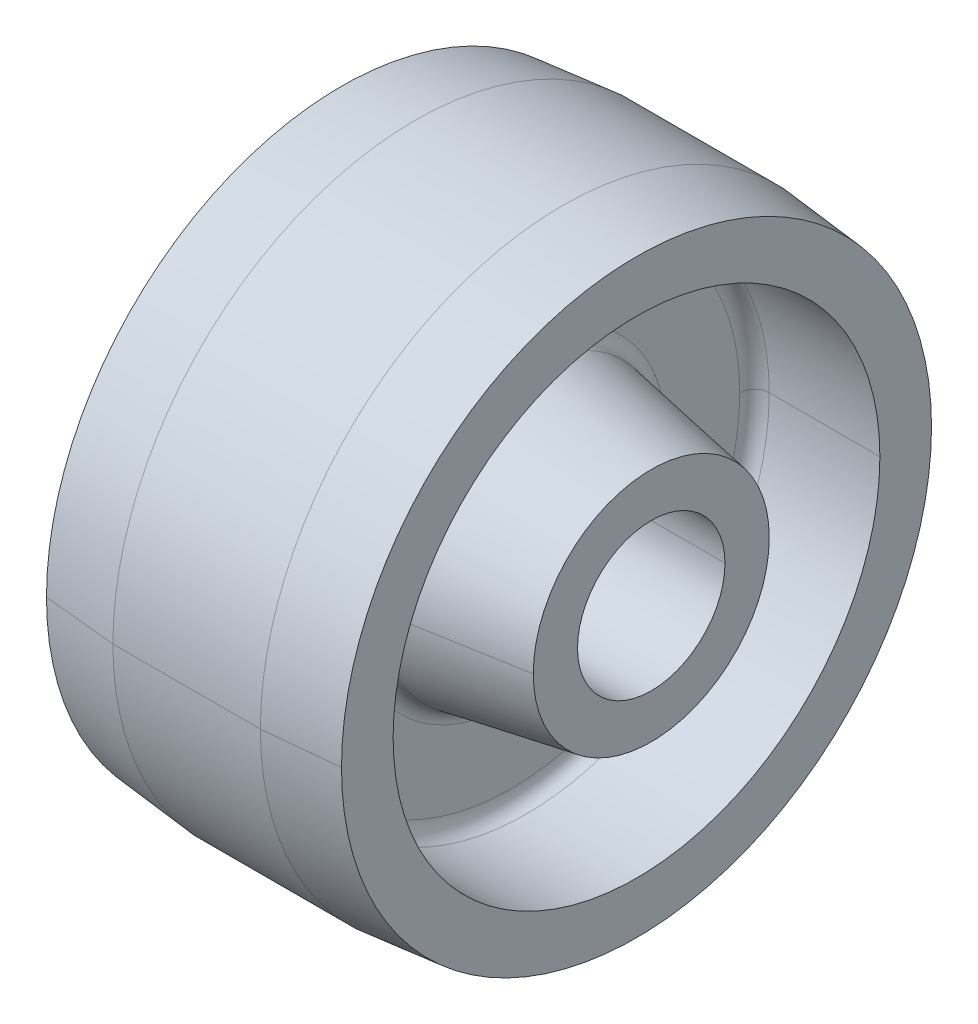
ISO-10303-21;
HEADER;
FILE_DESCRIPTION(('STEP AP214'),'2;1');
FILE_NAME('part.step','',(''),(''),'','','');
FILE_SCHEMA(('AUTOMOTIVE_DESIGN { 1 0 10303 214 1 1 1 1 }'));
ENDSEC;
DATA;
#1=APPLICATION_CONTEXT('core data for automotive mechanical design processes');
#2=APPLICATION_PROTOCOL_DEFINITION('international standard','automotive_design',2000,#1);
#3=PRODUCT_CONTEXT('',#1,'mechanical');
#4=PRODUCT('Part','Part','',(#3));
#5=PRODUCT_RELATED_PRODUCT_CATEGORY('part','',(#4));
#6=PRODUCT_DEFINITION_FORMATION('','',#4);
#7=PRODUCT_DEFINITION_CONTEXT('part definition',#1,'design');
#8=PRODUCT_DEFINITION('design','',#6,#7);
#9=PRODUCT_DEFINITION_SHAPE('','',#8);
#10=(LENGTH_UNIT() NAMED_UNIT(*) SI_UNIT(.MILLI.,.METRE.));
#11=(NAMED_UNIT(*) PLANE_ANGLE_UNIT() SI_UNIT($,.RADIAN.));
#12=(NAMED_UNIT(*) SI_UNIT($,.STERADIAN.) SOLID_ANGLE_UNIT());
#13=UNCERTAINTY_MEASURE_WITH_UNIT(LENGTH_MEASURE(1.E-05),#10,'distance_accuracy_value','');
#14=(GEOMETRIC_REPRESENTATION_CONTEXT(3) GLOBAL_UNCERTAINTY_ASSIGNED_CONTEXT((#13)) GLOBAL_UNIT_ASSIGNED_CONTEXT((#10,
#11,#12)) REPRESENTATION_CONTEXT('',''));
#15=CARTESIAN_POINT('',(0.,0.,0.));
#16=DIRECTION('',(0.,0.,1.));
#17=DIRECTION('',(1.,0.,0.));
#18=AXIS2_PLACEMENT_3D('',#15,#16,#17);
#19=CARTESIAN_POINT('',(-2.5,0.,0.));
#20=DIRECTION('',(-1.,0.,0.));
#21=DIRECTION('',(0.,0.,1.));
#22=AXIS2_PLACEMENT_3D('',#19,#20,#21);
#23=TOROIDAL_SURFACE('',#22,10.5142059479076,1.);
#24=CARTESIAN_POINT('',(-2.5,0.,-10.5142059479076));
#25=DIRECTION('',(0.,1.,0.));
#26=DIRECTION('',(0.,0.,1.));
#27=AXIS2_PLACEMENT_3D('',#24,#25,#26);
#28=CIRCLE('',#27,1.);
#29=CARTESIAN_POINT('',(-2.32635182233308,0.,-9.52939819489542));
#30=VERTEX_POINT('',#29);
#31=CARTESIAN_POINT('',(-1.5,0.,-10.5142059479076));
#32=VERTEX_POINT('',#31);
#33=EDGE_CURVE('E1033',#30,#32,#28,.T.);
#34=ORIENTED_EDGE('',*,*,#33,.F.);
#35=CARTESIAN_POINT('',(-2.32635182233308,0.,0.));
#36=DIRECTION('',(-1.,0.,0.));
#37=DIRECTION('',(0.,0.,1.));
#38=AXIS2_PLACEMENT_3D('',#35,#36,#37);
#39=CIRCLE('',#38,9.52939819489542);
#40=CARTESIAN_POINT('',(-2.32635182233308,0.,9.52939819489542));
#41=VERTEX_POINT('',#40);
#42=EDGE_CURVE('E326',#41,#30,#39,.T.);
#43=ORIENTED_EDGE('',*,*,#42,.F.);
#44=CARTESIAN_POINT('',(-2.5,0.,10.5142059479076));
#45=DIRECTION('',(0.,-1.,0.));
#46=DIRECTION('',(0.,0.,-1.));
#47=AXIS2_PLACEMENT_3D('',#44,#45,#46);
#48=CIRCLE('',#47,1.);
#49=CARTESIAN_POINT('',(-1.5,0.,10.5142059479076));
#50=VERTEX_POINT('',#49);
#51=EDGE_CURVE('E212',#41,#50,#48,.T.);
#52=ORIENTED_EDGE('',*,*,#51,.T.);
#53=CARTESIAN_POINT('',(-1.5,0.,0.));
#54=DIRECTION('',(-1.,0.,0.));
#55=DIRECTION('',(0.,0.,1.));
#56=AXIS2_PLACEMENT_3D('',#53,#54,#55);
#57=CIRCLE('',#56,10.5142059479076);
#58=EDGE_CURVE('E11',#50,#32,#57,.T.);
#59=ORIENTED_EDGE('',*,*,#58,.T.);
#60=EDGE_LOOP('',(#34,#43,#52,#59));
#61=FACE_BOUND('',#60,.T.);
#62=ADVANCED_FACE('F16',(#61),#23,.F.);
#63=CARTESIAN_POINT('',(-1.5,15.5,0.));
#64=DIRECTION('',(-1.,0.,0.));
#65=DIRECTION('',(0.,0.,1.));
#66=AXIS2_PLACEMENT_3D('',#63,#64,#65);
#67=PLANE('',#66);
#68=ORIENTED_EDGE('',*,*,#58,.F.);
#69=CARTESIAN_POINT('',(-1.5,0.,0.));
#70=DIRECTION('',(-1.,0.,0.));
#71=DIRECTION('',(0.,0.,1.));
#72=AXIS2_PLACEMENT_3D('',#69,#70,#71);
#73=CIRCLE('',#72,10.5142059479076);
#74=EDGE_CURVE('E219',#32,#50,#73,.T.);
#75=ORIENTED_EDGE('',*,*,#74,.F.);
#76=EDGE_LOOP('',(#68,#75));
#77=FACE_BOUND('',#76,.T.);
#78=CARTESIAN_POINT('',(-1.5,0.,0.));
#79=DIRECTION('',(-1.,0.,0.));
#80=DIRECTION('',(0.,0.,1.));
#81=AXIS2_PLACEMENT_3D('',#78,#79,#80);
#82=CIRCLE('',#81,15.5);
#83=CARTESIAN_POINT('',(-1.5,0.,15.5));
#84=VERTEX_POINT('',#83);
#85=CARTESIAN_POINT('',(-1.5,0.,-15.5));
#86=VERTEX_POINT('',#85);
#87=EDGE_CURVE('E24',#84,#86,#82,.T.);
#88=ORIENTED_EDGE('',*,*,#87,.T.);
#89=CARTESIAN_POINT('',(-1.5,0.,0.));
#90=DIRECTION('',(-1.,0.,0.));
#91=DIRECTION('',(0.,0.,1.));
#92=AXIS2_PLACEMENT_3D('',#89,#90,#91);
#93=CIRCLE('',#92,15.5);
#94=EDGE_CURVE('E191',#86,#84,#93,.T.);
#95=ORIENTED_EDGE('',*,*,#94,.T.);
#96=EDGE_LOOP('',(#88,#95));
#97=FACE_BOUND('',#96,.T.);
#98=ADVANCED_FACE('F188',(#77,#97),#67,.T.);
#99=CARTESIAN_POINT('',(-2.5,0.,0.));
#100=DIRECTION('',(-1.,0.,0.));
#101=DIRECTION('',(0.,0.,1.));
#102=AXIS2_PLACEMENT_3D('',#99,#100,#101);
#103=TOROIDAL_SURFACE('',#102,15.5,1.);
#104=CARTESIAN_POINT('',(-2.5,0.,-15.5));
#105=DIRECTION('',(0.,1.,0.));
#106=DIRECTION('',(0.,0.,1.));
#107=AXIS2_PLACEMENT_3D('',#104,#105,#106);
#108=CIRCLE('',#107,1.);
#109=CARTESIAN_POINT('',(-2.5,0.,-16.5));
#110=VERTEX_POINT('',#109);
#111=EDGE_CURVE('E199',#86,#110,#108,.T.);
#112=ORIENTED_EDGE('',*,*,#111,.F.);
#113=ORIENTED_EDGE('',*,*,#87,.F.);
#114=CARTESIAN_POINT('',(-2.5,0.,15.5));
#115=DIRECTION('',(0.,-1.,0.));
#116=DIRECTION('',(0.,0.,-1.));
#117=AXIS2_PLACEMENT_3D('',#114,#115,#116);
#118=CIRCLE('',#117,1.);
#119=CARTESIAN_POINT('',(-2.5,0.,16.5));
#120=VERTEX_POINT('',#119);
#121=EDGE_CURVE('E210',#84,#120,#118,.T.);
#122=ORIENTED_EDGE('',*,*,#121,.T.);
#123=CARTESIAN_POINT('',(-2.5,0.,0.));
#124=DIRECTION('',(-1.,0.,0.));
#125=DIRECTION('',(0.,0.,1.));
#126=AXIS2_PLACEMENT_3D('',#123,#124,#125);
#127=CIRCLE('',#126,16.5);
#128=EDGE_CURVE('E175',#120,#110,#127,.T.);
#129=ORIENTED_EDGE('',*,*,#128,.T.);
#130=EDGE_LOOP('',(#112,#113,#122,#129));
#131=FACE_BOUND('',#130,.T.);
#132=ADVANCED_FACE('F200',(#131),#103,.F.);
#133=CARTESIAN_POINT('',(-9.17002422126663,0.,0.));
#134=DIRECTION('',(-1.,0.,0.));
#135=DIRECTION('',(0.,0.,1.));
#136=AXIS2_PLACEMENT_3D('',#133,#134,#135);
#137=CYLINDRICAL_SURFACE('',#136,16.5);
#138=DIRECTION('',(-1.,0.,0.));
#139=VECTOR('',#138,1.);
#140=CARTESIAN_POINT('',(-9.17002422126663,0.,-16.5));
#141=LINE('',#140,#139);
#142=CARTESIAN_POINT('',(-10.,0.,-16.5));
#143=VERTEX_POINT('',#142);
#144=EDGE_CURVE('E247',#110,#143,#141,.T.);
#145=ORIENTED_EDGE('',*,*,#144,.F.);
#146=ORIENTED_EDGE('',*,*,#128,.F.);
#147=DIRECTION('',(-1.,0.,0.));
#148=VECTOR('',#147,1.);
#149=CARTESIAN_POINT('',(-9.17002422126663,0.,16.5));
#150=LINE('',#149,#148);
#151=CARTESIAN_POINT('',(-10.,0.,16.5));
#152=VERTEX_POINT('',#151);
#153=EDGE_CURVE('E236',#120,#152,#150,.T.);
#154=ORIENTED_EDGE('',*,*,#153,.T.);
#155=CARTESIAN_POINT('',(-10.,0.,0.));
#156=DIRECTION('',(-1.,0.,0.));
#157=DIRECTION('',(0.,0.,1.));
#158=AXIS2_PLACEMENT_3D('',#155,#156,#157);
#159=CIRCLE('',#158,16.5);
#160=EDGE_CURVE('E128',#152,#143,#159,.T.);
#161=ORIENTED_EDGE('',*,*,#160,.T.);
#162=EDGE_LOOP('',(#145,#146,#154,#161));
#163=FACE_BOUND('',#162,.T.);
#164=ADVANCED_FACE('F716',(#163),#137,.F.);
#165=CARTESIAN_POINT('',(2.5,0.,0.));
#166=DIRECTION('',(-1.,0.,0.));
#167=DIRECTION('',(0.,0.,1.));
#168=AXIS2_PLACEMENT_3D('',#165,#166,#167);
#169=TOROIDAL_SURFACE('',#168,15.5,1.);
#170=CARTESIAN_POINT('',(2.5,0.,-15.5));
#171=DIRECTION('',(0.,1.,0.));
#172=DIRECTION('',(0.,0.,1.));
#173=AXIS2_PLACEMENT_3D('',#170,#171,#172);
#174=CIRCLE('',#173,1.);
#175=CARTESIAN_POINT('',(2.5,0.,-16.5));
#176=VERTEX_POINT('',#175);
#177=CARTESIAN_POINT('',(1.5,0.,-15.5));
#178=VERTEX_POINT('',#177);
#179=EDGE_CURVE('E235',#176,#178,#174,.T.);
#180=ORIENTED_EDGE('',*,*,#179,.F.);
#181=CARTESIAN_POINT('',(2.5,0.,0.));
#182=DIRECTION('',(-1.,0.,0.));
#183=DIRECTION('',(0.,0.,1.));
#184=AXIS2_PLACEMENT_3D('',#181,#182,#183);
#185=CIRCLE('',#184,16.5);
#186=CARTESIAN_POINT('',(2.5,0.,16.5));
#187=VERTEX_POINT('',#186);
#188=EDGE_CURVE('E240',#187,#176,#185,.T.);
#189=ORIENTED_EDGE('',*,*,#188,.F.);
#190=CARTESIAN_POINT('',(2.5,0.,15.5));
#191=DIRECTION('',(0.,-1.,0.));
#192=DIRECTION('',(0.,0.,-1.));
#193=AXIS2_PLACEMENT_3D('',#190,#191,#192);
#194=CIRCLE('',#193,1.);
#195=CARTESIAN_POINT('',(1.5,0.,15.5));
#196=VERTEX_POINT('',#195);
#197=EDGE_CURVE('E223',#187,#196,#194,.T.);
#198=ORIENTED_EDGE('',*,*,#197,.T.);
#199=CARTESIAN_POINT('',(1.5,0.,0.));
#200=DIRECTION('',(-1.,0.,0.));
#201=DIRECTION('',(0.,0.,1.));
#202=AXIS2_PLACEMENT_3D('',#199,#200,#201);
#203=CIRCLE('',#202,15.5);
#204=EDGE_CURVE('E171',#196,#178,#203,.T.);
#205=ORIENTED_EDGE('',*,*,#204,.T.);
#206=EDGE_LOOP('',(#180,#189,#198,#205));
#207=FACE_BOUND('',#206,.T.);
#208=ADVANCED_FACE('F705',(#207),#169,.F.);
#209=CARTESIAN_POINT('',(1.5,10.5142059479076,0.));
#210=DIRECTION('',(1.,0.,0.));
#211=DIRECTION('',(0.,1.,0.));
#212=AXIS2_PLACEMENT_3D('',#209,#210,#211);
#213=PLANE('',#212);
#214=CARTESIAN_POINT('',(1.5,0.,0.));
#215=DIRECTION('',(-1.,0.,0.));
#216=DIRECTION('',(0.,0.,1.));
#217=AXIS2_PLACEMENT_3D('',#214,#215,#216);
#218=CIRCLE('',#217,10.5142059479076);
#219=CARTESIAN_POINT('',(1.5,0.,10.5142059479076));
#220=VERTEX_POINT('',#219);
#221=CARTESIAN_POINT('',(1.5,0.,-10.5142059479076));
#222=VERTEX_POINT('',#221);
#223=EDGE_CURVE('E176',#220,#222,#218,.T.);
#224=ORIENTED_EDGE('',*,*,#223,.T.);
#225=CARTESIAN_POINT('',(1.5,0.,0.));
#226=DIRECTION('',(-1.,0.,0.));
#227=DIRECTION('',(0.,0.,1.));
#228=AXIS2_PLACEMENT_3D('',#225,#226,#227);
#229=CIRCLE('',#228,10.5142059479076);
#230=EDGE_CURVE('E264',#222,#220,#229,.T.);
#231=ORIENTED_EDGE('',*,*,#230,.T.);
#232=EDGE_LOOP('',(#224,#231));
#233=FACE_BOUND('',#232,.T.);
#234=ORIENTED_EDGE('',*,*,#204,.F.);
#235=CARTESIAN_POINT('',(1.5,0.,0.));
#236=DIRECTION('',(-1.,0.,0.));
#237=DIRECTION('',(0.,0.,1.));
#238=AXIS2_PLACEMENT_3D('',#235,#236,#237);
#239=CIRCLE('',#238,15.5);
#240=EDGE_CURVE('E269',#178,#196,#239,.T.);
#241=ORIENTED_EDGE('',*,*,#240,.F.);
#242=EDGE_LOOP('',(#234,#241));
#243=FACE_BOUND('',#242,.T.);
#244=ADVANCED_FACE('F694',(#233,#243),#213,.T.);
#245=CARTESIAN_POINT('',(2.5,0.,0.));
#246=DIRECTION('',(-1.,0.,0.));
#247=DIRECTION('',(0.,0.,1.));
#248=AXIS2_PLACEMENT_3D('',#245,#246,#247);
#249=TOROIDAL_SURFACE('',#248,10.5142059479076,1.);
#250=CARTESIAN_POINT('',(2.5,0.,-10.5142059479076));
#251=DIRECTION('',(0.,1.,0.));
#252=DIRECTION('',(0.,0.,1.));
#253=AXIS2_PLACEMENT_3D('',#250,#251,#252);
#254=CIRCLE('',#253,1.);
#255=CARTESIAN_POINT('',(2.32635182233308,0.,-9.52939819489541));
#256=VERTEX_POINT('',#255);
#257=EDGE_CURVE('E268',#222,#256,#254,.T.);
#258=ORIENTED_EDGE('',*,*,#257,.F.);
#259=ORIENTED_EDGE('',*,*,#223,.F.);
#260=CARTESIAN_POINT('',(2.5,0.,10.5142059479076));
#261=DIRECTION('',(0.,-1.,0.));
#262=DIRECTION('',(0.,0.,-1.));
#263=AXIS2_PLACEMENT_3D('',#260,#261,#262);
#264=CIRCLE('',#263,1.);
#265=CARTESIAN_POINT('',(2.32635182233308,0.,9.52939819489541));
#266=VERTEX_POINT('',#265);
#267=EDGE_CURVE('E280',#220,#266,#264,.T.);
#268=ORIENTED_EDGE('',*,*,#267,.T.);
#269=CARTESIAN_POINT('',(2.32635182233308,0.,0.));
#270=DIRECTION('',(-1.,0.,0.));
#271=DIRECTION('',(0.,0.,1.));
#272=AXIS2_PLACEMENT_3D('',#269,#270,#271);
#273=CIRCLE('',#272,9.52939819489542);
#274=EDGE_CURVE('E161',#266,#256,#273,.T.);
#275=ORIENTED_EDGE('',*,*,#274,.T.);
#276=EDGE_LOOP('',(#258,#259,#268,#275));
#277=FACE_BOUND('',#276,.T.);
#278=ADVANCED_FACE('F685',(#277),#249,.F.);
#279=CARTESIAN_POINT('',(-9.17002422126663,0.,0.));
#280=DIRECTION('',(-1.,0.,0.));
#281=DIRECTION('',(0.,0.,1.));
#282=AXIS2_PLACEMENT_3D('',#279,#280,#281);
#283=CYLINDRICAL_SURFACE('',#282,16.5);
#284=DIRECTION('',(-1.,0.,0.));
#285=VECTOR('',#284,1.);
#286=CARTESIAN_POINT('',(-9.17002422126663,0.,-16.5));
#287=LINE('',#286,#285);
#288=CARTESIAN_POINT('',(10.,0.,-16.5));
#289=VERTEX_POINT('',#288);
#290=EDGE_CURVE('E291',#289,#176,#287,.T.);
#291=ORIENTED_EDGE('',*,*,#290,.F.);
#292=CARTESIAN_POINT('',(10.,0.,0.));
#293=DIRECTION('',(-1.,0.,0.));
#294=DIRECTION('',(0.,0.,1.));
#295=AXIS2_PLACEMENT_3D('',#292,#293,#294);
#296=CIRCLE('',#295,16.5);
#297=CARTESIAN_POINT('',(10.,0.,16.5));
#298=VERTEX_POINT('',#297);
#299=EDGE_CURVE('E127',#298,#289,#296,.T.);
#300=ORIENTED_EDGE('',*,*,#299,.F.);
#301=DIRECTION('',(-1.,0.,0.));
#302=VECTOR('',#301,1.);
#303=CARTESIAN_POINT('',(-9.17002422126663,0.,16.5));
#304=LINE('',#303,#302);
#305=EDGE_CURVE('E295',#298,#187,#304,.T.);
#306=ORIENTED_EDGE('',*,*,#305,.T.);
#307=ORIENTED_EDGE('',*,*,#188,.T.);
#308=EDGE_LOOP('',(#291,#300,#306,#307));
#309=FACE_BOUND('',#308,.T.);
#310=ADVANCED_FACE('F352',(#309),#283,.F.);
#311=CARTESIAN_POINT('',(-21.4247117377399,0.,0.));
#312=DIRECTION('',(-1.,0.,0.));
#313=DIRECTION('',(0.,0.,1.));
#314=AXIS2_PLACEMENT_3D('',#311,#312,#313);
#315=CYLINDRICAL_SURFACE('',#314,5.);
#316=DIRECTION('',(-1.,0.,0.));
#317=VECTOR('',#316,1.);
#318=CARTESIAN_POINT('',(-21.4247117377399,0.,-5.));
#319=LINE('',#318,#317);
#320=CARTESIAN_POINT('',(11.,0.,-5.));
#321=VERTEX_POINT('',#320);
#322=CARTESIAN_POINT('',(-11.,0.,-5.));
#323=VERTEX_POINT('',#322);
#324=EDGE_CURVE('E302',#321,#323,#319,.T.);
#325=ORIENTED_EDGE('',*,*,#324,.F.);
#326=CARTESIAN_POINT('',(11.,0.,0.));
#327=DIRECTION('',(-1.,0.,0.));
#328=DIRECTION('',(0.,0.,1.));
#329=AXIS2_PLACEMENT_3D('',#326,#327,#328);
#330=CIRCLE('',#329,5.);
#331=CARTESIAN_POINT('',(11.,0.,5.));
#332=VERTEX_POINT('',#331);
#333=EDGE_CURVE('E227',#332,#321,#330,.T.);
#334=ORIENTED_EDGE('',*,*,#333,.F.);
#335=DIRECTION('',(-1.,0.,0.));
#336=VECTOR('',#335,1.);
#337=CARTESIAN_POINT('',(-21.4247117377399,0.,5.));
#338=LINE('',#337,#336);
#339=CARTESIAN_POINT('',(-11.,0.,5.));
#340=VERTEX_POINT('',#339);
#341=EDGE_CURVE('E311',#332,#340,#338,.T.);
#342=ORIENTED_EDGE('',*,*,#341,.T.);
#343=CARTESIAN_POINT('',(-11.,0.,0.));
#344=DIRECTION('',(-1.,0.,0.));
#345=DIRECTION('',(0.,0.,1.));
#346=AXIS2_PLACEMENT_3D('',#343,#344,#345);
#347=CIRCLE('',#346,5.);
#348=EDGE_CURVE('E169',#340,#323,#347,.T.);
#349=ORIENTED_EDGE('',*,*,#348,.T.);
#350=EDGE_LOOP('',(#325,#334,#342,#349));
#351=FACE_BOUND('',#350,.T.);
#352=ADVANCED_FACE('F581',(#351),#315,.F.);
#353=CARTESIAN_POINT('',(-11.,5.,0.));
#354=DIRECTION('',(1.,0.,0.));
#355=DIRECTION('',(0.,1.,0.));
#356=AXIS2_PLACEMENT_3D('',#353,#354,#355);
#357=PLANE('',#356);
#358=ORIENTED_EDGE('',*,*,#348,.F.);
#359=CARTESIAN_POINT('',(-11.,0.,0.));
#360=DIRECTION('',(-1.,0.,0.));
#361=DIRECTION('',(0.,0.,1.));
#362=AXIS2_PLACEMENT_3D('',#359,#360,#361);
#363=CIRCLE('',#362,5.);
#364=EDGE_CURVE('E307',#323,#340,#363,.T.);
#365=ORIENTED_EDGE('',*,*,#364,.F.);
#366=EDGE_LOOP('',(#358,#365));
#367=FACE_BOUND('',#366,.T.);
#368=CARTESIAN_POINT('',(-11.,0.,0.));
#369=DIRECTION('',(-1.,0.,0.));
#370=DIRECTION('',(0.,0.,1.));
#371=AXIS2_PLACEMENT_3D('',#368,#369,#370);
#372=CIRCLE('',#371,8.);
#373=CARTESIAN_POINT('',(-11.,0.,-8.));
#374=VERTEX_POINT('',#373);
#375=CARTESIAN_POINT('',(-11.,0.,8.));
#376=VERTEX_POINT('',#375);
#377=EDGE_CURVE('E166',#374,#376,#372,.T.);
#378=ORIENTED_EDGE('',*,*,#377,.T.);
#379=CARTESIAN_POINT('',(-11.,0.,0.));
#380=DIRECTION('',(-1.,0.,0.));
#381=DIRECTION('',(0.,0.,1.));
#382=AXIS2_PLACEMENT_3D('',#379,#380,#381);
#383=CIRCLE('',#382,8.);
#384=EDGE_CURVE('E315',#376,#374,#383,.T.);
#385=ORIENTED_EDGE('',*,*,#384,.T.);
#386=EDGE_LOOP('',(#378,#385));
#387=FACE_BOUND('',#386,.T.);
#388=ADVANCED_FACE('F586',(#367,#387),#357,.F.);
#389=CARTESIAN_POINT('',(-10.,0.,0.));
#390=DIRECTION('',(1.,0.,0.));
#391=DIRECTION('',(0.,0.,-1.));
#392=AXIS2_PLACEMENT_3D('',#389,#390,#391);
#393=CONICAL_SURFACE('',#392,8.17632698070846,0.174532925199425);
#394=DIRECTION('',(0.984807753012209,0.,0.173648177666923));
#395=VECTOR('',#394,1.);
#396=CARTESIAN_POINT('',(-10.,0.,8.17632698070846));
#397=LINE('',#396,#395);
#398=EDGE_CURVE('E322',#376,#41,#397,.T.);
#399=ORIENTED_EDGE('',*,*,#398,.F.);
#400=ORIENTED_EDGE('',*,*,#377,.F.);
#401=DIRECTION('',(0.984807753012209,0.,-0.173648177666923));
#402=VECTOR('',#401,1.);
#403=CARTESIAN_POINT('',(-10.,0.,-8.17632698070846));
#404=LINE('',#403,#402);
#405=EDGE_CURVE('E263',#374,#30,#404,.T.);
#406=ORIENTED_EDGE('',*,*,#405,.T.);
#407=CARTESIAN_POINT('',(-2.32635182233308,0.,0.));
#408=DIRECTION('',(-1.,0.,0.));
#409=DIRECTION('',(0.,0.,1.));
#410=AXIS2_PLACEMENT_3D('',#407,#408,#409);
#411=CIRCLE('',#410,9.52939819489542);
#412=EDGE_CURVE('E1036',#30,#41,#411,.T.);
#413=ORIENTED_EDGE('',*,*,#412,.T.);
#414=EDGE_LOOP('',(#399,#400,#406,#413));
#415=FACE_BOUND('',#414,.T.);
#416=ADVANCED_FACE('F654',(#415),#393,.T.);
#417=CARTESIAN_POINT('',(-5.,0.,0.));
#418=DIRECTION('',(1.,0.,0.));
#419=DIRECTION('',(0.,0.,-1.));
#420=AXIS2_PLACEMENT_3D('',#417,#418,#419);
#421=CONICAL_SURFACE('',#420,20.5,0.0996686524911618);
#422=DIRECTION('',(0.995037190209989,0.,0.099503719020999));
#423=VECTOR('',#422,1.);
#424=CARTESIAN_POINT('',(-5.,0.,20.5));
#425=LINE('',#424,#423);
#426=CARTESIAN_POINT('',(-10.,0.,20.));
#427=VERTEX_POINT('',#426);
#428=CARTESIAN_POINT('',(-5.,0.,20.5));
#429=VERTEX_POINT('',#428);
#430=EDGE_CURVE('E262',#427,#429,#425,.T.);
#431=ORIENTED_EDGE('',*,*,#430,.F.);
#432=CARTESIAN_POINT('',(-10.,0.,0.));
#433=DIRECTION('',(-1.,0.,0.));
#434=DIRECTION('',(0.,0.,1.));
#435=AXIS2_PLACEMENT_3D('',#432,#433,#434);
#436=CIRCLE('',#435,20.);
#437=CARTESIAN_POINT('',(-10.,0.,-20.));
#438=VERTEX_POINT('',#437);
#439=EDGE_CURVE('E162',#438,#427,#436,.T.);
#440=ORIENTED_EDGE('',*,*,#439,.F.);
#441=DIRECTION('',(0.995037190209989,0.,-0.099503719020999));
#442=VECTOR('',#441,1.);
#443=CARTESIAN_POINT('',(-5.,0.,-20.5));
#444=LINE('',#443,#442);
#445=CARTESIAN_POINT('',(-5.,0.,-20.5));
#446=VERTEX_POINT('',#445);
#447=EDGE_CURVE('E287',#438,#446,#444,.T.);
#448=ORIENTED_EDGE('',*,*,#447,.T.);
#449=CARTESIAN_POINT('',(-5.,0.,0.));
#450=DIRECTION('',(-1.,0.,0.));
#451=DIRECTION('',(0.,0.,1.));
#452=AXIS2_PLACEMENT_3D('',#449,#450,#451);
#453=CIRCLE('',#452,20.5);
#454=EDGE_CURVE('E170',#446,#429,#453,.T.);
#455=ORIENTED_EDGE('',*,*,#454,.T.);
#456=EDGE_LOOP('',(#431,#440,#448,#455));
#457=FACE_BOUND('',#456,.T.);
#458=ADVANCED_FACE('F643',(#457),#421,.T.);
#459=CARTESIAN_POINT('',(-21.4247117377399,0.,0.));
#460=DIRECTION('',(-1.,0.,0.));
#461=DIRECTION('',(0.,0.,1.));
#462=AXIS2_PLACEMENT_3D('',#459,#460,#461);
#463=CYLINDRICAL_SURFACE('',#462,20.5);
#464=DIRECTION('',(-1.,0.,0.));
#465=VECTOR('',#464,1.);
#466=CARTESIAN_POINT('',(-21.4247117377399,0.,-20.5));
#467=LINE('',#466,#465);
#468=CARTESIAN_POINT('',(5.,0.,-20.5));
#469=VERTEX_POINT('',#468);
#470=EDGE_CURVE('E151',#469,#446,#467,.T.);
#471=ORIENTED_EDGE('',*,*,#470,.F.);
#472=CARTESIAN_POINT('',(5.,0.,0.));
#473=DIRECTION('',(-1.,0.,0.));
#474=DIRECTION('',(0.,0.,1.));
#475=AXIS2_PLACEMENT_3D('',#472,#473,#474);
#476=CIRCLE('',#475,20.5);
#477=CARTESIAN_POINT('',(5.,0.,20.5));
#478=VERTEX_POINT('',#477);
#479=EDGE_CURVE('E225',#469,#478,#476,.T.);
#480=ORIENTED_EDGE('',*,*,#479,.T.);
#481=DIRECTION('',(-1.,0.,0.));
#482=VECTOR('',#481,1.);
#483=CARTESIAN_POINT('',(-21.4247117377399,0.,20.5));
#484=LINE('',#483,#482);
#485=EDGE_CURVE('E141',#478,#429,#484,.T.);
#486=ORIENTED_EDGE('',*,*,#485,.T.);
#487=ORIENTED_EDGE('',*,*,#454,.F.);
#488=EDGE_LOOP('',(#471,#480,#486,#487));
#489=FACE_BOUND('',#488,.T.);
#490=ADVANCED_FACE('F633',(#489),#463,.T.);
#491=CARTESIAN_POINT('',(10.,0.,0.));
#492=DIRECTION('',(-1.,0.,0.));
#493=DIRECTION('',(0.,0.,1.));
#494=AXIS2_PLACEMENT_3D('',#491,#492,#493);
#495=CONICAL_SURFACE('',#494,20.,0.0996686524911618);
#496=DIRECTION('',(-0.995037190209989,0.,-0.099503719020999));
#497=VECTOR('',#496,1.);
#498=CARTESIAN_POINT('',(10.,0.,-20.));
#499=LINE('',#498,#497);
#500=CARTESIAN_POINT('',(10.,0.,-20.));
#501=VERTEX_POINT('',#500);
#502=EDGE_CURVE('E122',#501,#469,#499,.T.);
#503=ORIENTED_EDGE('',*,*,#502,.F.);
#504=CARTESIAN_POINT('',(10.,0.,0.));
#505=DIRECTION('',(-1.,0.,0.));
#506=DIRECTION('',(0.,0.,1.));
#507=AXIS2_PLACEMENT_3D('',#504,#505,#506);
#508=CIRCLE('',#507,20.);
#509=CARTESIAN_POINT('',(10.,0.,20.));
#510=VERTEX_POINT('',#509);
#511=EDGE_CURVE('E116',#501,#510,#508,.T.);
#512=ORIENTED_EDGE('',*,*,#511,.T.);
#513=DIRECTION('',(-0.995037190209989,0.,0.099503719020999));
#514=VECTOR('',#513,1.);
#515=CARTESIAN_POINT('',(10.,0.,20.));
#516=LINE('',#515,#514);
#517=EDGE_CURVE('E119',#510,#478,#516,.T.);
#518=ORIENTED_EDGE('',*,*,#517,.T.);
#519=ORIENTED_EDGE('',*,*,#479,.F.);
#520=EDGE_LOOP('',(#503,#512,#518,#519));
#521=FACE_BOUND('',#520,.T.);
#522=ADVANCED_FACE('F118',(#521),#495,.T.);
#523=CARTESIAN_POINT('',(11.,0.,0.));
#524=DIRECTION('',(-1.,0.,0.));
#525=DIRECTION('',(0.,0.,1.));
#526=AXIS2_PLACEMENT_3D('',#523,#524,#525);
#527=CONICAL_SURFACE('',#526,8.,0.174532925199424);
#528=DIRECTION('',(-0.984807753012209,0.,-0.173648177666922));
#529=VECTOR('',#528,1.);
#530=CARTESIAN_POINT('',(11.,0.,-8.));
#531=LINE('',#530,#529);
#532=CARTESIAN_POINT('',(11.,0.,-8.));
#533=VERTEX_POINT('',#532);
#534=EDGE_CURVE('E158',#533,#256,#531,.T.);
#535=ORIENTED_EDGE('',*,*,#534,.F.);
#536=CARTESIAN_POINT('',(11.,0.,0.));
#537=DIRECTION('',(-1.,0.,0.));
#538=DIRECTION('',(0.,0.,1.));
#539=AXIS2_PLACEMENT_3D('',#536,#537,#538);
#540=CIRCLE('',#539,8.);
#541=CARTESIAN_POINT('',(11.,0.,8.));
#542=VERTEX_POINT('',#541);
#543=EDGE_CURVE('E36',#533,#542,#540,.T.);
#544=ORIENTED_EDGE('',*,*,#543,.T.);
#545=DIRECTION('',(-0.984807753012209,0.,0.173648177666922));
#546=VECTOR('',#545,1.);
#547=CARTESIAN_POINT('',(11.,0.,8.));
#548=LINE('',#547,#546);
#549=EDGE_CURVE('E165',#542,#266,#548,.T.);
#550=ORIENTED_EDGE('',*,*,#549,.T.);
#551=CARTESIAN_POINT('',(2.32635182233308,0.,0.));
#552=DIRECTION('',(-1.,0.,0.));
#553=DIRECTION('',(0.,0.,1.));
#554=AXIS2_PLACEMENT_3D('',#551,#552,#553);
#555=CIRCLE('',#554,9.52939819489542);
#556=EDGE_CURVE('E276',#256,#266,#555,.T.);
#557=ORIENTED_EDGE('',*,*,#556,.F.);
#558=EDGE_LOOP('',(#535,#544,#550,#557));
#559=FACE_BOUND('',#558,.T.);
#560=ADVANCED_FACE('F539',(#559),#527,.T.);
#561=CARTESIAN_POINT('',(11.,5.,0.));
#562=DIRECTION('',(-1.,0.,0.));
#563=DIRECTION('',(0.,0.,1.));
#564=AXIS2_PLACEMENT_3D('',#561,#562,#563);
#565=PLANE('',#564);
#566=ORIENTED_EDGE('',*,*,#333,.T.);
#567=CARTESIAN_POINT('',(11.,0.,0.));
#568=DIRECTION('',(-1.,0.,0.));
#569=DIRECTION('',(0.,0.,1.));
#570=AXIS2_PLACEMENT_3D('',#567,#568,#569);
#571=CIRCLE('',#570,5.);
#572=EDGE_CURVE('E299',#321,#332,#571,.T.);
#573=ORIENTED_EDGE('',*,*,#572,.T.);
#574=EDGE_LOOP('',(#566,#573));
#575=FACE_BOUND('',#574,.T.);
#576=CARTESIAN_POINT('',(11.,0.,0.));
#577=DIRECTION('',(-1.,0.,0.));
#578=DIRECTION('',(0.,0.,1.));
#579=AXIS2_PLACEMENT_3D('',#576,#577,#578);
#580=CIRCLE('',#579,8.);
#581=EDGE_CURVE('E137',#542,#533,#580,.T.);
#582=ORIENTED_EDGE('',*,*,#581,.F.);
#583=ORIENTED_EDGE('',*,*,#543,.F.);
#584=EDGE_LOOP('',(#582,#583));
#585=FACE_BOUND('',#584,.T.);
#586=ADVANCED_FACE('F544',(#575,#585),#565,.F.);
#587=CARTESIAN_POINT('',(10.,8.17632698070846,0.));
#588=DIRECTION('',(-1.,0.,0.));
#589=DIRECTION('',(0.,0.,1.));
#590=AXIS2_PLACEMENT_3D('',#587,#588,#589);
#591=PLANE('',#590);
#592=ORIENTED_EDGE('',*,*,#299,.T.);
#593=CARTESIAN_POINT('',(10.,0.,0.));
#594=DIRECTION('',(-1.,0.,0.));
#595=DIRECTION('',(0.,0.,1.));
#596=AXIS2_PLACEMENT_3D('',#593,#594,#595);
#597=CIRCLE('',#596,16.5);
#598=EDGE_CURVE('E283',#289,#298,#597,.T.);
#599=ORIENTED_EDGE('',*,*,#598,.T.);
#600=EDGE_LOOP('',(#592,#599));
#601=FACE_BOUND('',#600,.T.);
#602=CARTESIAN_POINT('',(10.,0.,0.));
#603=DIRECTION('',(-1.,0.,0.));
#604=DIRECTION('',(0.,0.,1.));
#605=AXIS2_PLACEMENT_3D('',#602,#603,#604);
#606=CIRCLE('',#605,20.);
#607=EDGE_CURVE('E133',#510,#501,#606,.T.);
#608=ORIENTED_EDGE('',*,*,#607,.F.);
#609=ORIENTED_EDGE('',*,*,#511,.F.);
#610=EDGE_LOOP('',(#608,#609));
#611=FACE_BOUND('',#610,.T.);
#612=ADVANCED_FACE('F139',(#601,#611),#591,.F.);
#613=CARTESIAN_POINT('',(-10.,20.,0.));
#614=DIRECTION('',(1.,0.,0.));
#615=DIRECTION('',(0.,1.,0.));
#616=AXIS2_PLACEMENT_3D('',#613,#614,#615);
#617=PLANE('',#616);
#618=ORIENTED_EDGE('',*,*,#160,.F.);
#619=CARTESIAN_POINT('',(-10.,0.,0.));
#620=DIRECTION('',(-1.,0.,0.));
#621=DIRECTION('',(0.,0.,1.));
#622=AXIS2_PLACEMENT_3D('',#619,#620,#621);
#623=CIRCLE('',#622,16.5);
#624=EDGE_CURVE('E251',#143,#152,#623,.T.);
#625=ORIENTED_EDGE('',*,*,#624,.F.);
#626=EDGE_LOOP('',(#618,#625));
#627=FACE_BOUND('',#626,.T.);
#628=ORIENTED_EDGE('',*,*,#439,.T.);
#629=CARTESIAN_POINT('',(-10.,0.,0.));
#630=DIRECTION('',(-1.,0.,0.));
#631=DIRECTION('',(0.,0.,1.));
#632=AXIS2_PLACEMENT_3D('',#629,#630,#631);
#633=CIRCLE('',#632,20.);
#634=EDGE_CURVE('E258',#427,#438,#633,.T.);
#635=ORIENTED_EDGE('',*,*,#634,.T.);
#636=EDGE_LOOP('',(#628,#635));
#637=FACE_BOUND('',#636,.T.);
#638=ADVANCED_FACE('F569',(#627,#637),#617,.F.);
#639=CARTESIAN_POINT('',(11.,0.,0.));
#640=DIRECTION('',(-1.,0.,0.));
#641=DIRECTION('',(0.,0.,1.));
#642=AXIS2_PLACEMENT_3D('',#639,#640,#641);
#643=CONICAL_SURFACE('',#642,8.,0.174532925199424);
#644=ORIENTED_EDGE('',*,*,#581,.T.);
#645=ORIENTED_EDGE('',*,*,#534,.T.);
#646=ORIENTED_EDGE('',*,*,#274,.F.);
#647=ORIENTED_EDGE('',*,*,#549,.F.);
#648=EDGE_LOOP('',(#644,#645,#646,#647));
#649=FACE_BOUND('',#648,.T.);
#650=ADVANCED_FACE('F468',(#649),#643,.T.);
#651=CARTESIAN_POINT('',(10.,0.,0.));
#652=DIRECTION('',(-1.,0.,0.));
#653=DIRECTION('',(0.,0.,1.));
#654=AXIS2_PLACEMENT_3D('',#651,#652,#653);
#655=CONICAL_SURFACE('',#654,20.,0.0996686524911618);
#656=ORIENTED_EDGE('',*,*,#607,.T.);
#657=ORIENTED_EDGE('',*,*,#502,.T.);
#658=CARTESIAN_POINT('',(5.,0.,0.));
#659=DIRECTION('',(-1.,0.,0.));
#660=DIRECTION('',(0.,0.,1.));
#661=AXIS2_PLACEMENT_3D('',#658,#659,#660);
#662=CIRCLE('',#661,20.5);
#663=EDGE_CURVE('E135',#478,#469,#662,.T.);
#664=ORIENTED_EDGE('',*,*,#663,.F.);
#665=ORIENTED_EDGE('',*,*,#517,.F.);
#666=EDGE_LOOP('',(#656,#657,#664,#665));
#667=FACE_BOUND('',#666,.T.);
#668=ADVANCED_FACE('F132',(#667),#655,.T.);
#669=CARTESIAN_POINT('',(-21.4247117377399,0.,0.));
#670=DIRECTION('',(-1.,0.,0.));
#671=DIRECTION('',(0.,0.,1.));
#672=AXIS2_PLACEMENT_3D('',#669,#670,#671);
#673=CYLINDRICAL_SURFACE('',#672,20.5);
#674=ORIENTED_EDGE('',*,*,#663,.T.);
#675=ORIENTED_EDGE('',*,*,#470,.T.);
#676=CARTESIAN_POINT('',(-5.,0.,0.));
#677=DIRECTION('',(-1.,0.,0.));
#678=DIRECTION('',(0.,0.,1.));
#679=AXIS2_PLACEMENT_3D('',#676,#677,#678);
#680=CIRCLE('',#679,20.5);
#681=EDGE_CURVE('E284',#429,#446,#680,.T.);
#682=ORIENTED_EDGE('',*,*,#681,.F.);
#683=ORIENTED_EDGE('',*,*,#485,.F.);
#684=EDGE_LOOP('',(#674,#675,#682,#683));
#685=FACE_BOUND('',#684,.T.);
#686=ADVANCED_FACE('F454',(#685),#673,.T.);
#687=CARTESIAN_POINT('',(-5.,0.,0.));
#688=DIRECTION('',(1.,0.,0.));
#689=DIRECTION('',(0.,0.,-1.));
#690=AXIS2_PLACEMENT_3D('',#687,#688,#689);
#691=CONICAL_SURFACE('',#690,20.5,0.0996686524911618);
#692=ORIENTED_EDGE('',*,*,#634,.F.);
#693=ORIENTED_EDGE('',*,*,#430,.T.);
#694=ORIENTED_EDGE('',*,*,#681,.T.);
#695=ORIENTED_EDGE('',*,*,#447,.F.);
#696=EDGE_LOOP('',(#692,#693,#694,#695));
#697=FACE_BOUND('',#696,.T.);
#698=ADVANCED_FACE('F448',(#697),#691,.T.);
#699=CARTESIAN_POINT('',(-10.,0.,0.));
#700=DIRECTION('',(1.,0.,0.));
#701=DIRECTION('',(0.,0.,-1.));
#702=AXIS2_PLACEMENT_3D('',#699,#700,#701);
#703=CONICAL_SURFACE('',#702,8.17632698070846,0.174532925199425);
#704=ORIENTED_EDGE('',*,*,#384,.F.);
#705=ORIENTED_EDGE('',*,*,#398,.T.);
#706=ORIENTED_EDGE('',*,*,#42,.T.);
#707=ORIENTED_EDGE('',*,*,#405,.F.);
#708=EDGE_LOOP('',(#704,#705,#706,#707));
#709=FACE_BOUND('',#708,.T.);
#710=ADVANCED_FACE('F453',(#709),#703,.T.);
#711=CARTESIAN_POINT('',(-21.4247117377399,0.,0.));
#712=DIRECTION('',(-1.,0.,0.));
#713=DIRECTION('',(0.,0.,1.));
#714=AXIS2_PLACEMENT_3D('',#711,#712,#713);
#715=CYLINDRICAL_SURFACE('',#714,5.);
#716=ORIENTED_EDGE('',*,*,#572,.F.);
#717=ORIENTED_EDGE('',*,*,#324,.T.);
#718=ORIENTED_EDGE('',*,*,#364,.T.);
#719=ORIENTED_EDGE('',*,*,#341,.F.);
#720=EDGE_LOOP('',(#716,#717,#718,#719));
#721=FACE_BOUND('',#720,.T.);
#722=ADVANCED_FACE('F528',(#721),#715,.F.);
#723=CARTESIAN_POINT('',(-9.17002422126663,0.,0.));
#724=DIRECTION('',(-1.,0.,0.));
#725=DIRECTION('',(0.,0.,1.));
#726=AXIS2_PLACEMENT_3D('',#723,#724,#725);
#727=CYLINDRICAL_SURFACE('',#726,16.5);
#728=ORIENTED_EDGE('',*,*,#598,.F.);
#729=ORIENTED_EDGE('',*,*,#290,.T.);
#730=CARTESIAN_POINT('',(2.5,0.,0.));
#731=DIRECTION('',(-1.,0.,0.));
#732=DIRECTION('',(0.,0.,1.));
#733=AXIS2_PLACEMENT_3D('',#730,#731,#732);
#734=CIRCLE('',#733,16.5);
#735=EDGE_CURVE('E231',#176,#187,#734,.T.);
#736=ORIENTED_EDGE('',*,*,#735,.T.);
#737=ORIENTED_EDGE('',*,*,#305,.F.);
#738=EDGE_LOOP('',(#728,#729,#736,#737));
#739=FACE_BOUND('',#738,.T.);
#740=ADVANCED_FACE('F357',(#739),#727,.F.);
#741=CARTESIAN_POINT('',(2.5,0.,0.));
#742=DIRECTION('',(-1.,0.,0.));
#743=DIRECTION('',(0.,0.,1.));
#744=AXIS2_PLACEMENT_3D('',#741,#742,#743);
#745=TOROIDAL_SURFACE('',#744,10.5142059479076,1.);
#746=ORIENTED_EDGE('',*,*,#230,.F.);
#747=ORIENTED_EDGE('',*,*,#257,.T.);
#748=ORIENTED_EDGE('',*,*,#556,.T.);
#749=ORIENTED_EDGE('',*,*,#267,.F.);
#750=EDGE_LOOP('',(#746,#747,#748,#749));
#751=FACE_BOUND('',#750,.T.);
#752=ADVANCED_FACE('F511',(#751),#745,.F.);
#753=CARTESIAN_POINT('',(2.5,0.,0.));
#754=DIRECTION('',(-1.,0.,0.));
#755=DIRECTION('',(0.,0.,1.));
#756=AXIS2_PLACEMENT_3D('',#753,#754,#755);
#757=TOROIDAL_SURFACE('',#756,15.5,1.);
#758=ORIENTED_EDGE('',*,*,#735,.F.);
#759=ORIENTED_EDGE('',*,*,#179,.T.);
#760=ORIENTED_EDGE('',*,*,#240,.T.);
#761=ORIENTED_EDGE('',*,*,#197,.F.);
#762=EDGE_LOOP('',(#758,#759,#760,#761));
#763=FACE_BOUND('',#762,.T.);
#764=ADVANCED_FACE('F366',(#763),#757,.F.);
#765=CARTESIAN_POINT('',(-9.17002422126663,0.,0.));
#766=DIRECTION('',(-1.,0.,0.));
#767=DIRECTION('',(0.,0.,1.));
#768=AXIS2_PLACEMENT_3D('',#765,#766,#767);
#769=CYLINDRICAL_SURFACE('',#768,16.5);
#770=CARTESIAN_POINT('',(-2.5,0.,0.));
#771=DIRECTION('',(-1.,0.,0.));
#772=DIRECTION('',(0.,0.,1.));
#773=AXIS2_PLACEMENT_3D('',#770,#771,#772);
#774=CIRCLE('',#773,16.5);
#775=EDGE_CURVE('E207',#110,#120,#774,.T.);
#776=ORIENTED_EDGE('',*,*,#775,.F.);
#777=ORIENTED_EDGE('',*,*,#144,.T.);
#778=ORIENTED_EDGE('',*,*,#624,.T.);
#779=ORIENTED_EDGE('',*,*,#153,.F.);
#780=EDGE_LOOP('',(#776,#777,#778,#779));
#781=FACE_BOUND('',#780,.T.);
#782=ADVANCED_FACE('F491',(#781),#769,.F.);
#783=CARTESIAN_POINT('',(-2.5,0.,0.));
#784=DIRECTION('',(-1.,0.,0.));
#785=DIRECTION('',(0.,0.,1.));
#786=AXIS2_PLACEMENT_3D('',#783,#784,#785);
#787=TOROIDAL_SURFACE('',#786,15.5,1.);
#788=ORIENTED_EDGE('',*,*,#94,.F.);
#789=ORIENTED_EDGE('',*,*,#111,.T.);
#790=ORIENTED_EDGE('',*,*,#775,.T.);
#791=ORIENTED_EDGE('',*,*,#121,.F.);
#792=EDGE_LOOP('',(#788,#789,#790,#791));
#793=FACE_BOUND('',#792,.T.);
#794=ADVANCED_FACE('F209',(#793),#787,.F.);
#795=CARTESIAN_POINT('',(-2.5,0.,0.));
#796=DIRECTION('',(-1.,0.,0.));
#797=DIRECTION('',(0.,0.,1.));
#798=AXIS2_PLACEMENT_3D('',#795,#796,#797);
#799=TOROIDAL_SURFACE('',#798,10.5142059479076,1.);
#800=ORIENTED_EDGE('',*,*,#412,.F.);
#801=ORIENTED_EDGE('',*,*,#33,.T.);
#802=ORIENTED_EDGE('',*,*,#74,.T.);
#803=ORIENTED_EDGE('',*,*,#51,.F.);
#804=EDGE_LOOP('',(#800,#801,#802,#803));
#805=FACE_BOUND('',#804,.T.);
#806=ADVANCED_FACE('F475',(#805),#799,.F.);
#807=CLOSED_SHELL('',(#62,#98,#132,#164,#208,#244,#278,#310,#352,#388,#416,#458,#490,#522,#560,
#586,#612,#638,#650,#668,#686,#698,#710,#722,#740,#752,#764,#782,#794,#806));
#808=MANIFOLD_SOLID_BREP('B1',#807);
#809=ADVANCED_BREP_SHAPE_REPRESENTATION('',(#18,#808),#14);
#810=SHAPE_DEFINITION_REPRESENTATION(#9,#809);
ENDSEC;
END-ISO-10303-21;
